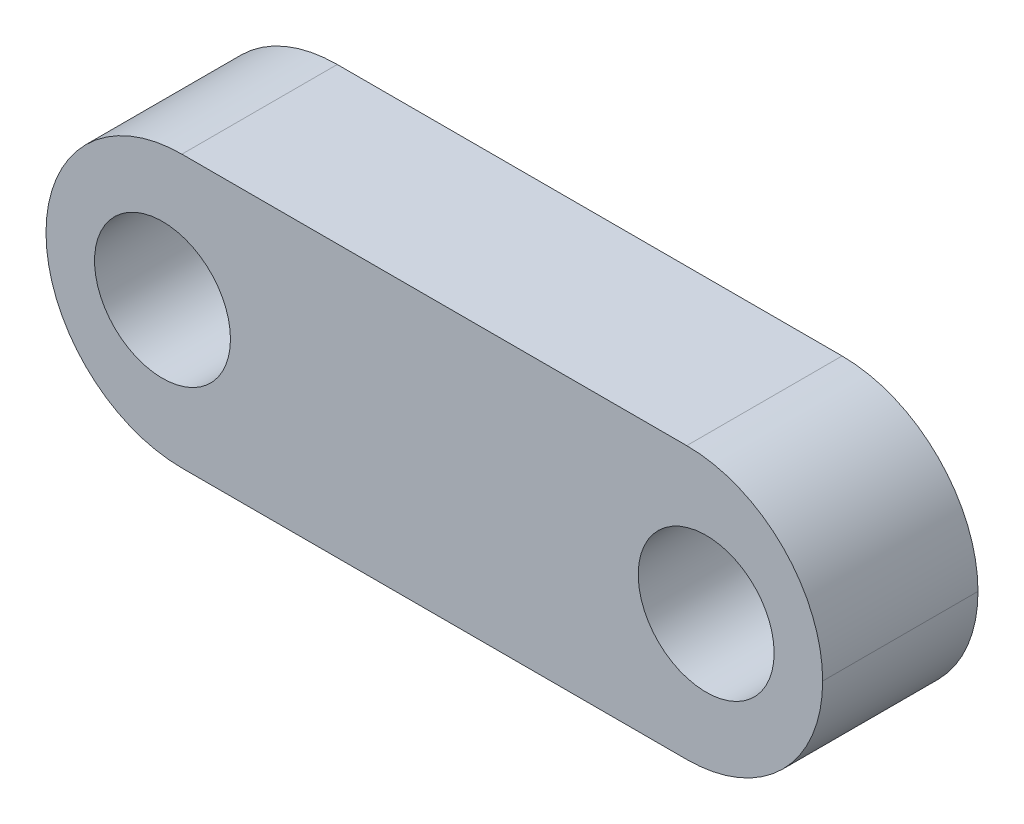
ISO-10303-21;
HEADER;
FILE_DESCRIPTION(('STEP AP214'),'2;1');
FILE_NAME('part.step','',(''),(''),'','','');
FILE_SCHEMA(('AUTOMOTIVE_DESIGN { 1 0 10303 214 1 1 1 1 }'));
ENDSEC;
DATA;
#1=APPLICATION_CONTEXT('core data for automotive mechanical design processes');
#2=APPLICATION_PROTOCOL_DEFINITION('international standard','automotive_design',2000,#1);
#3=PRODUCT_CONTEXT('',#1,'mechanical');
#4=PRODUCT('Part','Part','',(#3));
#5=PRODUCT_RELATED_PRODUCT_CATEGORY('part','',(#4));
#6=PRODUCT_DEFINITION_FORMATION('','',#4);
#7=PRODUCT_DEFINITION_CONTEXT('part definition',#1,'design');
#8=PRODUCT_DEFINITION('design','',#6,#7);
#9=PRODUCT_DEFINITION_SHAPE('','',#8);
#10=(LENGTH_UNIT() NAMED_UNIT(*) SI_UNIT(.MILLI.,.METRE.));
#11=(NAMED_UNIT(*) PLANE_ANGLE_UNIT() SI_UNIT($,.RADIAN.));
#12=(NAMED_UNIT(*) SI_UNIT($,.STERADIAN.) SOLID_ANGLE_UNIT());
#13=UNCERTAINTY_MEASURE_WITH_UNIT(LENGTH_MEASURE(1.E-05),#10,'distance_accuracy_value','');
#14=(GEOMETRIC_REPRESENTATION_CONTEXT(3) GLOBAL_UNCERTAINTY_ASSIGNED_CONTEXT((#13)) GLOBAL_UNIT_ASSIGNED_CONTEXT((#10,
#11,#12)) REPRESENTATION_CONTEXT('',''));
#15=CARTESIAN_POINT('',(0.,0.,0.));
#16=DIRECTION('',(0.,0.,1.));
#17=DIRECTION('',(1.,0.,0.));
#18=AXIS2_PLACEMENT_3D('',#15,#16,#17);
#19=CARTESIAN_POINT('',(0.,0.,4.));
#20=DIRECTION('',(0.,0.,-1.));
#21=DIRECTION('',(-1.,0.,0.));
#22=AXIS2_PLACEMENT_3D('',#19,#20,#21);
#23=PLANE('',#22);
#24=DIRECTION('',(1.,0.,0.));
#25=VECTOR('',#24,1.);
#26=CARTESIAN_POINT('',(-10.,3.5,4.));
#27=LINE('',#26,#25);
#28=CARTESIAN_POINT('',(-6.5,3.5,4.));
#29=VERTEX_POINT('',#28);
#30=CARTESIAN_POINT('',(6.5,3.5,4.));
#31=VERTEX_POINT('',#30);
#32=EDGE_CURVE('E177',#29,#31,#27,.T.);
#33=ORIENTED_EDGE('',*,*,#32,.F.);
#34=CARTESIAN_POINT('',(-6.5,0.,4.));
#35=DIRECTION('',(0.,0.,-1.));
#36=DIRECTION('',(-1.,0.,0.));
#37=AXIS2_PLACEMENT_3D('',#34,#35,#36);
#38=CIRCLE('',#37,3.5);
#39=CARTESIAN_POINT('',(-10.,0.,4.));
#40=VERTEX_POINT('',#39);
#41=EDGE_CURVE('E86',#29,#40,#38,.F.);
#42=ORIENTED_EDGE('',*,*,#41,.T.);
#43=CARTESIAN_POINT('',(-6.5,0.,4.));
#44=DIRECTION('',(0.,0.,-1.));
#45=DIRECTION('',(-1.,0.,0.));
#46=AXIS2_PLACEMENT_3D('',#43,#44,#45);
#47=CIRCLE('',#46,3.5);
#48=CARTESIAN_POINT('',(-6.5,-3.5,4.));
#49=VERTEX_POINT('',#48);
#50=EDGE_CURVE('E160',#40,#49,#47,.F.);
#51=ORIENTED_EDGE('',*,*,#50,.T.);
#52=DIRECTION('',(1.,0.,0.));
#53=VECTOR('',#52,1.);
#54=CARTESIAN_POINT('',(-10.,-3.5,4.));
#55=LINE('',#54,#53);
#56=CARTESIAN_POINT('',(6.5,-3.5,4.));
#57=VERTEX_POINT('',#56);
#58=EDGE_CURVE('E128',#49,#57,#55,.T.);
#59=ORIENTED_EDGE('',*,*,#58,.T.);
#60=CARTESIAN_POINT('',(6.5,0.,4.));
#61=DIRECTION('',(0.,0.,-1.));
#62=DIRECTION('',(-1.,0.,0.));
#63=AXIS2_PLACEMENT_3D('',#60,#61,#62);
#64=CIRCLE('',#63,3.5);
#65=CARTESIAN_POINT('',(10.,0.,4.));
#66=VERTEX_POINT('',#65);
#67=EDGE_CURVE('E93',#57,#66,#64,.F.);
#68=ORIENTED_EDGE('',*,*,#67,.T.);
#69=CARTESIAN_POINT('',(6.5,0.,4.));
#70=DIRECTION('',(0.,0.,-1.));
#71=DIRECTION('',(-1.,0.,0.));
#72=AXIS2_PLACEMENT_3D('',#69,#70,#71);
#73=CIRCLE('',#72,3.5);
#74=EDGE_CURVE('E157',#66,#31,#73,.F.);
#75=ORIENTED_EDGE('',*,*,#74,.T.);
#76=EDGE_LOOP('',(#33,#42,#51,#59,#68,#75));
#77=FACE_BOUND('',#76,.T.);
#78=CARTESIAN_POINT('',(-7.,0.,4.));
#79=DIRECTION('',(0.,0.,1.));
#80=DIRECTION('',(1.,0.,0.));
#81=AXIS2_PLACEMENT_3D('',#78,#79,#80);
#82=CIRCLE('',#81,1.75);
#83=CARTESIAN_POINT('',(-5.25,0.,4.));
#84=VERTEX_POINT('',#83);
#85=EDGE_CURVE('E139',#84,#84,#82,.T.);
#86=ORIENTED_EDGE('',*,*,#85,.F.);
#87=EDGE_LOOP('',(#86));
#88=FACE_BOUND('',#87,.T.);
#89=CARTESIAN_POINT('',(7.,0.,4.));
#90=DIRECTION('',(0.,0.,1.));
#91=DIRECTION('',(1.,0.,0.));
#92=AXIS2_PLACEMENT_3D('',#89,#90,#91);
#93=CIRCLE('',#92,1.75);
#94=CARTESIAN_POINT('',(8.75,0.,4.));
#95=VERTEX_POINT('',#94);
#96=EDGE_CURVE('E166',#95,#95,#93,.T.);
#97=ORIENTED_EDGE('',*,*,#96,.F.);
#98=EDGE_LOOP('',(#97));
#99=FACE_BOUND('',#98,.T.);
#100=ADVANCED_FACE('F69',(#77,#88,#99),#23,.F.);
#101=CARTESIAN_POINT('',(0.,0.,0.));
#102=DIRECTION('',(0.,0.,-1.));
#103=DIRECTION('',(-1.,0.,0.));
#104=AXIS2_PLACEMENT_3D('',#101,#102,#103);
#105=PLANE('',#104);
#106=CARTESIAN_POINT('',(-7.,0.,0.));
#107=DIRECTION('',(0.,0.,1.));
#108=DIRECTION('',(1.,0.,0.));
#109=AXIS2_PLACEMENT_3D('',#106,#107,#108);
#110=CIRCLE('',#109,1.75);
#111=CARTESIAN_POINT('',(-5.25,0.,0.));
#112=VERTEX_POINT('',#111);
#113=EDGE_CURVE('E276',#112,#112,#110,.T.);
#114=ORIENTED_EDGE('',*,*,#113,.T.);
#115=EDGE_LOOP('',(#114));
#116=FACE_BOUND('',#115,.T.);
#117=CARTESIAN_POINT('',(-6.5,0.,0.));
#118=DIRECTION('',(0.,0.,-1.));
#119=DIRECTION('',(-1.,0.,0.));
#120=AXIS2_PLACEMENT_3D('',#117,#118,#119);
#121=CIRCLE('',#120,3.5);
#122=CARTESIAN_POINT('',(-6.5,-3.5,0.));
#123=VERTEX_POINT('',#122);
#124=CARTESIAN_POINT('',(-10.,0.,0.));
#125=VERTEX_POINT('',#124);
#126=EDGE_CURVE('E134',#123,#125,#121,.T.);
#127=ORIENTED_EDGE('',*,*,#126,.T.);
#128=CARTESIAN_POINT('',(-6.5,0.,0.));
#129=DIRECTION('',(0.,0.,-1.));
#130=DIRECTION('',(-1.,0.,0.));
#131=AXIS2_PLACEMENT_3D('',#128,#129,#130);
#132=CIRCLE('',#131,3.5);
#133=CARTESIAN_POINT('',(-6.5,3.5,0.));
#134=VERTEX_POINT('',#133);
#135=EDGE_CURVE('E145',#125,#134,#132,.T.);
#136=ORIENTED_EDGE('',*,*,#135,.T.);
#137=DIRECTION('',(1.,0.,0.));
#138=VECTOR('',#137,1.);
#139=CARTESIAN_POINT('',(-10.,3.5,0.));
#140=LINE('',#139,#138);
#141=CARTESIAN_POINT('',(6.5,3.5,0.));
#142=VERTEX_POINT('',#141);
#143=EDGE_CURVE('E138',#134,#142,#140,.T.);
#144=ORIENTED_EDGE('',*,*,#143,.T.);
#145=CARTESIAN_POINT('',(6.5,0.,0.));
#146=DIRECTION('',(0.,0.,-1.));
#147=DIRECTION('',(-1.,0.,0.));
#148=AXIS2_PLACEMENT_3D('',#145,#146,#147);
#149=CIRCLE('',#148,3.5);
#150=CARTESIAN_POINT('',(10.,0.,0.));
#151=VERTEX_POINT('',#150);
#152=EDGE_CURVE('E149',#142,#151,#149,.T.);
#153=ORIENTED_EDGE('',*,*,#152,.T.);
#154=CARTESIAN_POINT('',(6.5,0.,0.));
#155=DIRECTION('',(0.,0.,-1.));
#156=DIRECTION('',(-1.,0.,0.));
#157=AXIS2_PLACEMENT_3D('',#154,#155,#156);
#158=CIRCLE('',#157,3.5);
#159=CARTESIAN_POINT('',(6.5,-3.5,0.));
#160=VERTEX_POINT('',#159);
#161=EDGE_CURVE('E137',#151,#160,#158,.T.);
#162=ORIENTED_EDGE('',*,*,#161,.T.);
#163=DIRECTION('',(1.,0.,0.));
#164=VECTOR('',#163,1.);
#165=CARTESIAN_POINT('',(-10.,-3.5,0.));
#166=LINE('',#165,#164);
#167=EDGE_CURVE('E126',#123,#160,#166,.T.);
#168=ORIENTED_EDGE('',*,*,#167,.F.);
#169=EDGE_LOOP('',(#127,#136,#144,#153,#162,#168));
#170=FACE_BOUND('',#169,.T.);
#171=CARTESIAN_POINT('',(7.,0.,0.));
#172=DIRECTION('',(0.,0.,1.));
#173=DIRECTION('',(1.,0.,0.));
#174=AXIS2_PLACEMENT_3D('',#171,#172,#173);
#175=CIRCLE('',#174,1.75);
#176=CARTESIAN_POINT('',(8.75,0.,0.));
#177=VERTEX_POINT('',#176);
#178=EDGE_CURVE('E163',#177,#177,#175,.T.);
#179=ORIENTED_EDGE('',*,*,#178,.T.);
#180=EDGE_LOOP('',(#179));
#181=FACE_BOUND('',#180,.T.);
#182=ADVANCED_FACE('F132',(#116,#170,#181),#105,.T.);
#183=CARTESIAN_POINT('',(-10.,-3.5,4.));
#184=DIRECTION('',(0.,1.,0.));
#185=DIRECTION('',(0.,0.,1.));
#186=AXIS2_PLACEMENT_3D('',#183,#184,#185);
#187=PLANE('',#186);
#188=ORIENTED_EDGE('',*,*,#58,.F.);
#189=DIRECTION('',(0.,0.,-1.));
#190=VECTOR('',#189,1.);
#191=CARTESIAN_POINT('',(-6.5,-3.5,4.));
#192=LINE('',#191,#190);
#193=EDGE_CURVE('E12',#49,#123,#192,.T.);
#194=ORIENTED_EDGE('',*,*,#193,.T.);
#195=ORIENTED_EDGE('',*,*,#167,.T.);
#196=DIRECTION('',(0.,0.,-1.));
#197=VECTOR('',#196,1.);
#198=CARTESIAN_POINT('',(6.5,-3.5,4.));
#199=LINE('',#198,#197);
#200=EDGE_CURVE('E78',#160,#57,#199,.F.);
#201=ORIENTED_EDGE('',*,*,#200,.T.);
#202=EDGE_LOOP('',(#188,#194,#195,#201));
#203=FACE_BOUND('',#202,.T.);
#204=ADVANCED_FACE('F124',(#203),#187,.F.);
#205=CARTESIAN_POINT('',(-10.,3.5,4.));
#206=DIRECTION('',(0.,1.,0.));
#207=DIRECTION('',(0.,0.,1.));
#208=AXIS2_PLACEMENT_3D('',#205,#206,#207);
#209=PLANE('',#208);
#210=ORIENTED_EDGE('',*,*,#143,.F.);
#211=DIRECTION('',(0.,0.,-1.));
#212=VECTOR('',#211,1.);
#213=CARTESIAN_POINT('',(-6.5,3.5,4.));
#214=LINE('',#213,#212);
#215=EDGE_CURVE('E154',#134,#29,#214,.F.);
#216=ORIENTED_EDGE('',*,*,#215,.T.);
#217=ORIENTED_EDGE('',*,*,#32,.T.);
#218=DIRECTION('',(0.,0.,-1.));
#219=VECTOR('',#218,1.);
#220=CARTESIAN_POINT('',(6.5,3.5,4.));
#221=LINE('',#220,#219);
#222=EDGE_CURVE('E147',#31,#142,#221,.T.);
#223=ORIENTED_EDGE('',*,*,#222,.T.);
#224=EDGE_LOOP('',(#210,#216,#217,#223));
#225=FACE_BOUND('',#224,.T.);
#226=ADVANCED_FACE('F180',(#225),#209,.T.);
#227=CARTESIAN_POINT('',(-7.,0.,4.));
#228=DIRECTION('',(0.,0.,-1.));
#229=DIRECTION('',(-1.,0.,0.));
#230=AXIS2_PLACEMENT_3D('',#227,#228,#229);
#231=CYLINDRICAL_SURFACE('',#230,1.75);
#232=ORIENTED_EDGE('',*,*,#85,.T.);
#233=EDGE_LOOP('',(#232));
#234=FACE_BOUND('',#233,.T.);
#235=ORIENTED_EDGE('',*,*,#113,.F.);
#236=EDGE_LOOP('',(#235));
#237=FACE_BOUND('',#236,.T.);
#238=ADVANCED_FACE('F206',(#234,#237),#231,.F.);
#239=CARTESIAN_POINT('',(7.,0.,4.));
#240=DIRECTION('',(0.,0.,-1.));
#241=DIRECTION('',(-1.,0.,0.));
#242=AXIS2_PLACEMENT_3D('',#239,#240,#241);
#243=CYLINDRICAL_SURFACE('',#242,1.75);
#244=ORIENTED_EDGE('',*,*,#96,.T.);
#245=EDGE_LOOP('',(#244));
#246=FACE_BOUND('',#245,.T.);
#247=ORIENTED_EDGE('',*,*,#178,.F.);
#248=EDGE_LOOP('',(#247));
#249=FACE_BOUND('',#248,.T.);
#250=ADVANCED_FACE('F194',(#246,#249),#243,.F.);
#251=CARTESIAN_POINT('',(-6.5,0.,4.));
#252=DIRECTION('',(0.,0.,-1.));
#253=DIRECTION('',(-1.,0.,0.));
#254=AXIS2_PLACEMENT_3D('',#251,#252,#253);
#255=CYLINDRICAL_SURFACE('',#254,3.5);
#256=ORIENTED_EDGE('',*,*,#193,.F.);
#257=ORIENTED_EDGE('',*,*,#50,.F.);
#258=DIRECTION('',(0.,0.,-1.));
#259=VECTOR('',#258,1.);
#260=CARTESIAN_POINT('',(-10.,0.,4.));
#261=LINE('',#260,#259);
#262=EDGE_CURVE('E143',#125,#40,#261,.F.);
#263=ORIENTED_EDGE('',*,*,#262,.F.);
#264=ORIENTED_EDGE('',*,*,#126,.F.);
#265=EDGE_LOOP('',(#256,#257,#263,#264));
#266=FACE_BOUND('',#265,.T.);
#267=ADVANCED_FACE('F141',(#266),#255,.T.);
#268=CARTESIAN_POINT('',(-6.5,0.,4.));
#269=DIRECTION('',(0.,0.,1.));
#270=DIRECTION('',(1.,0.,0.));
#271=AXIS2_PLACEMENT_3D('',#268,#269,#270);
#272=CYLINDRICAL_SURFACE('',#271,3.5);
#273=ORIENTED_EDGE('',*,*,#41,.F.);
#274=ORIENTED_EDGE('',*,*,#215,.F.);
#275=ORIENTED_EDGE('',*,*,#135,.F.);
#276=ORIENTED_EDGE('',*,*,#262,.T.);
#277=EDGE_LOOP('',(#273,#274,#275,#276));
#278=FACE_BOUND('',#277,.T.);
#279=ADVANCED_FACE('F187',(#278),#272,.T.);
#280=CARTESIAN_POINT('',(6.5,0.,4.));
#281=DIRECTION('',(0.,0.,-1.));
#282=DIRECTION('',(-1.,0.,0.));
#283=AXIS2_PLACEMENT_3D('',#280,#281,#282);
#284=CYLINDRICAL_SURFACE('',#283,3.5);
#285=ORIENTED_EDGE('',*,*,#222,.F.);
#286=ORIENTED_EDGE('',*,*,#74,.F.);
#287=DIRECTION('',(0.,0.,-1.));
#288=VECTOR('',#287,1.);
#289=CARTESIAN_POINT('',(10.,0.,4.));
#290=LINE('',#289,#288);
#291=EDGE_CURVE('E73',#151,#66,#290,.F.);
#292=ORIENTED_EDGE('',*,*,#291,.F.);
#293=ORIENTED_EDGE('',*,*,#152,.F.);
#294=EDGE_LOOP('',(#285,#286,#292,#293));
#295=FACE_BOUND('',#294,.T.);
#296=ADVANCED_FACE('F71',(#295),#284,.T.);
#297=CARTESIAN_POINT('',(6.5,0.,4.));
#298=DIRECTION('',(0.,0.,1.));
#299=DIRECTION('',(1.,0.,0.));
#300=AXIS2_PLACEMENT_3D('',#297,#298,#299);
#301=CYLINDRICAL_SURFACE('',#300,3.5);
#302=ORIENTED_EDGE('',*,*,#67,.F.);
#303=ORIENTED_EDGE('',*,*,#200,.F.);
#304=ORIENTED_EDGE('',*,*,#161,.F.);
#305=ORIENTED_EDGE('',*,*,#291,.T.);
#306=EDGE_LOOP('',(#302,#303,#304,#305));
#307=FACE_BOUND('',#306,.T.);
#308=ADVANCED_FACE('F171',(#307),#301,.T.);
#309=CLOSED_SHELL('',(#100,#182,#204,#226,#238,#250,#267,#279,#296,#308));
#310=MANIFOLD_SOLID_BREP('B2',#309);
#311=ADVANCED_BREP_SHAPE_REPRESENTATION('',(#18,#310),#14);
#312=SHAPE_DEFINITION_REPRESENTATION(#9,#311);
ENDSEC;
END-ISO-10303-21;
